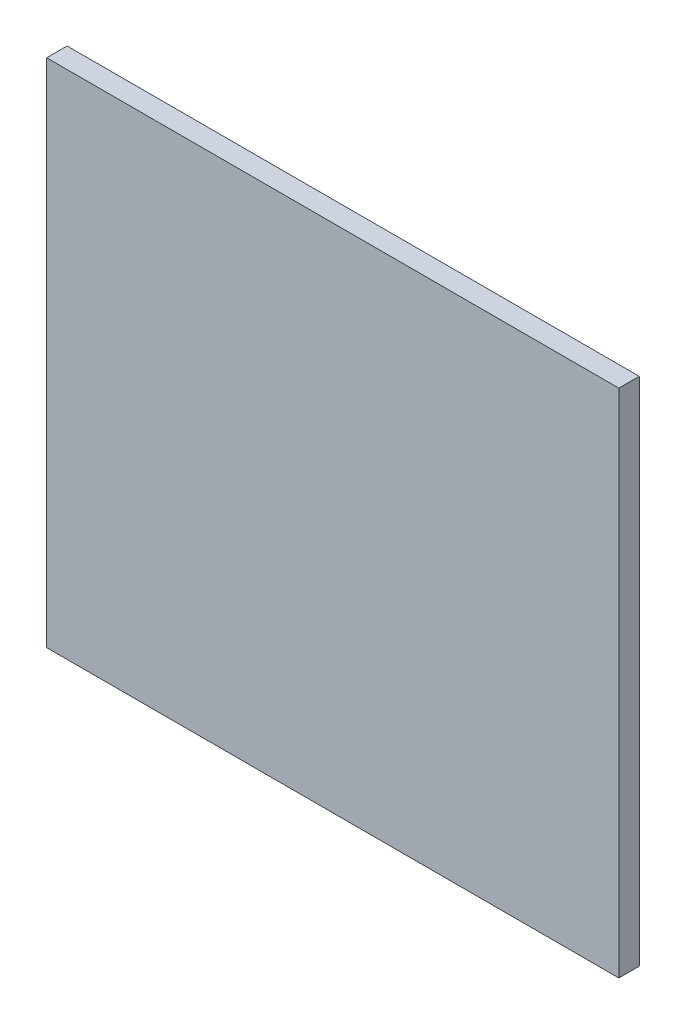
ISO-10303-21;
HEADER;
FILE_DESCRIPTION(('STEP AP214'),'2;1');
FILE_NAME('part.step','',(''),(''),'','','');
FILE_SCHEMA(('AUTOMOTIVE_DESIGN { 1 0 10303 214 1 1 1 1 }'));
ENDSEC;
DATA;
#1=APPLICATION_CONTEXT('core data for automotive mechanical design processes');
#2=APPLICATION_PROTOCOL_DEFINITION('international standard','automotive_design',2000,#1);
#3=PRODUCT_CONTEXT('',#1,'mechanical');
#4=PRODUCT('Part','Part','',(#3));
#5=PRODUCT_RELATED_PRODUCT_CATEGORY('part','',(#4));
#6=PRODUCT_DEFINITION_FORMATION('','',#4);
#7=PRODUCT_DEFINITION_CONTEXT('part definition',#1,'design');
#8=PRODUCT_DEFINITION('design','',#6,#7);
#9=PRODUCT_DEFINITION_SHAPE('','',#8);
#10=(LENGTH_UNIT() NAMED_UNIT(*) SI_UNIT(.MILLI.,.METRE.));
#11=(NAMED_UNIT(*) PLANE_ANGLE_UNIT() SI_UNIT($,.RADIAN.));
#12=(NAMED_UNIT(*) SI_UNIT($,.STERADIAN.) SOLID_ANGLE_UNIT());
#13=UNCERTAINTY_MEASURE_WITH_UNIT(LENGTH_MEASURE(1.E-05),#10,'distance_accuracy_value','');
#14=(GEOMETRIC_REPRESENTATION_CONTEXT(3) GLOBAL_UNCERTAINTY_ASSIGNED_CONTEXT((#13)) GLOBAL_UNIT_ASSIGNED_CONTEXT((#10,
#11,#12)) REPRESENTATION_CONTEXT('',''));
#15=CARTESIAN_POINT('',(0.,0.,0.));
#16=DIRECTION('',(0.,0.,1.));
#17=DIRECTION('',(1.,0.,0.));
#18=AXIS2_PLACEMENT_3D('',#15,#16,#17);
#19=CARTESIAN_POINT('',(88.9,-79.375,6.35));
#20=DIRECTION('',(-1.,0.,0.));
#21=DIRECTION('',(0.,0.,1.));
#22=AXIS2_PLACEMENT_3D('',#19,#20,#21);
#23=PLANE('',#22);
#24=DIRECTION('',(0.,1.,0.));
#25=VECTOR('',#24,1.);
#26=CARTESIAN_POINT('',(88.9,-79.375,0.));
#27=LINE('',#26,#25);
#28=CARTESIAN_POINT('',(88.9,-79.375,0.));
#29=VERTEX_POINT('',#28);
#30=CARTESIAN_POINT('',(88.9,79.375,0.));
#31=VERTEX_POINT('',#30);
#32=EDGE_CURVE('E96',#29,#31,#27,.T.);
#33=ORIENTED_EDGE('',*,*,#32,.T.);
#34=DIRECTION('',(0.,0.,-1.));
#35=VECTOR('',#34,1.);
#36=CARTESIAN_POINT('',(88.9,79.375,6.35));
#37=LINE('',#36,#35);
#38=CARTESIAN_POINT('',(88.9,79.375,6.35));
#39=VERTEX_POINT('',#38);
#40=EDGE_CURVE('E11',#39,#31,#37,.T.);
#41=ORIENTED_EDGE('',*,*,#40,.F.);
#42=DIRECTION('',(0.,1.,0.));
#43=VECTOR('',#42,1.);
#44=CARTESIAN_POINT('',(88.9,-79.375,6.35));
#45=LINE('',#44,#43);
#46=CARTESIAN_POINT('',(88.9,-79.375,6.35));
#47=VERTEX_POINT('',#46);
#48=EDGE_CURVE('E84',#47,#39,#45,.T.);
#49=ORIENTED_EDGE('',*,*,#48,.F.);
#50=DIRECTION('',(0.,0.,-1.));
#51=VECTOR('',#50,1.);
#52=CARTESIAN_POINT('',(88.9,-79.375,6.35));
#53=LINE('',#52,#51);
#54=EDGE_CURVE('E92',#47,#29,#53,.T.);
#55=ORIENTED_EDGE('',*,*,#54,.T.);
#56=EDGE_LOOP('',(#33,#41,#49,#55));
#57=FACE_BOUND('',#56,.T.);
#58=ADVANCED_FACE('F33',(#57),#23,.F.);
#59=CARTESIAN_POINT('',(-88.9,79.375,6.35));
#60=DIRECTION('',(0.,-1.,0.));
#61=DIRECTION('',(0.,0.,-1.));
#62=AXIS2_PLACEMENT_3D('',#59,#60,#61);
#63=PLANE('',#62);
#64=DIRECTION('',(-1.,0.,0.));
#65=VECTOR('',#64,1.);
#66=CARTESIAN_POINT('',(-88.9,79.375,0.));
#67=LINE('',#66,#65);
#68=CARTESIAN_POINT('',(-88.9,79.375,0.));
#69=VERTEX_POINT('',#68);
#70=EDGE_CURVE('E88',#31,#69,#67,.T.);
#71=ORIENTED_EDGE('',*,*,#70,.T.);
#72=DIRECTION('',(0.,0.,-1.));
#73=VECTOR('',#72,1.);
#74=CARTESIAN_POINT('',(-88.9,79.375,6.35));
#75=LINE('',#74,#73);
#76=CARTESIAN_POINT('',(-88.9,79.375,6.35));
#77=VERTEX_POINT('',#76);
#78=EDGE_CURVE('E41',#77,#69,#75,.T.);
#79=ORIENTED_EDGE('',*,*,#78,.F.);
#80=DIRECTION('',(-1.,0.,0.));
#81=VECTOR('',#80,1.);
#82=CARTESIAN_POINT('',(-88.9,79.375,6.35));
#83=LINE('',#82,#81);
#84=EDGE_CURVE('E79',#39,#77,#83,.T.);
#85=ORIENTED_EDGE('',*,*,#84,.F.);
#86=ORIENTED_EDGE('',*,*,#40,.T.);
#87=EDGE_LOOP('',(#71,#79,#85,#86));
#88=FACE_BOUND('',#87,.T.);
#89=ADVANCED_FACE('F87',(#88),#63,.F.);
#90=CARTESIAN_POINT('',(-88.9,-79.375,6.35));
#91=DIRECTION('',(1.,0.,0.));
#92=DIRECTION('',(0.,0.,-1.));
#93=AXIS2_PLACEMENT_3D('',#90,#91,#92);
#94=PLANE('',#93);
#95=DIRECTION('',(0.,-1.,0.));
#96=VECTOR('',#95,1.);
#97=CARTESIAN_POINT('',(-88.9,-79.375,0.));
#98=LINE('',#97,#96);
#99=CARTESIAN_POINT('',(-88.9,-79.375,0.));
#100=VERTEX_POINT('',#99);
#101=EDGE_CURVE('E66',#69,#100,#98,.T.);
#102=ORIENTED_EDGE('',*,*,#101,.T.);
#103=DIRECTION('',(0.,0.,-1.));
#104=VECTOR('',#103,1.);
#105=CARTESIAN_POINT('',(-88.9,-79.375,6.35));
#106=LINE('',#105,#104);
#107=CARTESIAN_POINT('',(-88.9,-79.375,6.35));
#108=VERTEX_POINT('',#107);
#109=EDGE_CURVE('E89',#108,#100,#106,.T.);
#110=ORIENTED_EDGE('',*,*,#109,.F.);
#111=DIRECTION('',(0.,-1.,0.));
#112=VECTOR('',#111,1.);
#113=CARTESIAN_POINT('',(-88.9,-79.375,6.35));
#114=LINE('',#113,#112);
#115=EDGE_CURVE('E82',#77,#108,#114,.T.);
#116=ORIENTED_EDGE('',*,*,#115,.F.);
#117=ORIENTED_EDGE('',*,*,#78,.T.);
#118=EDGE_LOOP('',(#102,#110,#116,#117));
#119=FACE_BOUND('',#118,.T.);
#120=ADVANCED_FACE('F90',(#119),#94,.F.);
#121=CARTESIAN_POINT('',(-88.9,-79.375,6.35));
#122=DIRECTION('',(0.,1.,0.));
#123=DIRECTION('',(0.,0.,1.));
#124=AXIS2_PLACEMENT_3D('',#121,#122,#123);
#125=PLANE('',#124);
#126=DIRECTION('',(1.,0.,0.));
#127=VECTOR('',#126,1.);
#128=CARTESIAN_POINT('',(-88.9,-79.375,0.));
#129=LINE('',#128,#127);
#130=EDGE_CURVE('E72',#100,#29,#129,.T.);
#131=ORIENTED_EDGE('',*,*,#130,.T.);
#132=ORIENTED_EDGE('',*,*,#54,.F.);
#133=DIRECTION('',(1.,0.,0.));
#134=VECTOR('',#133,1.);
#135=CARTESIAN_POINT('',(-88.9,-79.375,6.35));
#136=LINE('',#135,#134);
#137=EDGE_CURVE('E49',#108,#47,#136,.T.);
#138=ORIENTED_EDGE('',*,*,#137,.F.);
#139=ORIENTED_EDGE('',*,*,#109,.T.);
#140=EDGE_LOOP('',(#131,#132,#138,#139));
#141=FACE_BOUND('',#140,.T.);
#142=ADVANCED_FACE('F103',(#141),#125,.F.);
#143=CARTESIAN_POINT('',(0.,0.,6.35));
#144=DIRECTION('',(0.,0.,-1.));
#145=DIRECTION('',(-1.,0.,0.));
#146=AXIS2_PLACEMENT_3D('',#143,#144,#145);
#147=PLANE('',#146);
#148=ORIENTED_EDGE('',*,*,#48,.T.);
#149=ORIENTED_EDGE('',*,*,#84,.T.);
#150=ORIENTED_EDGE('',*,*,#115,.T.);
#151=ORIENTED_EDGE('',*,*,#137,.T.);
#152=EDGE_LOOP('',(#148,#149,#150,#151));
#153=FACE_BOUND('',#152,.T.);
#154=ADVANCED_FACE('F80',(#153),#147,.F.);
#155=CARTESIAN_POINT('',(0.,0.,0.));
#156=DIRECTION('',(0.,0.,-1.));
#157=DIRECTION('',(-1.,0.,0.));
#158=AXIS2_PLACEMENT_3D('',#155,#156,#157);
#159=PLANE('',#158);
#160=ORIENTED_EDGE('',*,*,#32,.F.);
#161=ORIENTED_EDGE('',*,*,#130,.F.);
#162=ORIENTED_EDGE('',*,*,#101,.F.);
#163=ORIENTED_EDGE('',*,*,#70,.F.);
#164=EDGE_LOOP('',(#160,#161,#162,#163));
#165=FACE_BOUND('',#164,.T.);
#166=ADVANCED_FACE('F106',(#165),#159,.T.);
#167=CLOSED_SHELL('',(#58,#89,#120,#142,#154,#166));
#168=MANIFOLD_SOLID_BREP('B2',#167);
#169=ADVANCED_BREP_SHAPE_REPRESENTATION('',(#18,#168),#14);
#170=SHAPE_DEFINITION_REPRESENTATION(#9,#169);
ENDSEC;
END-ISO-10303-21;
